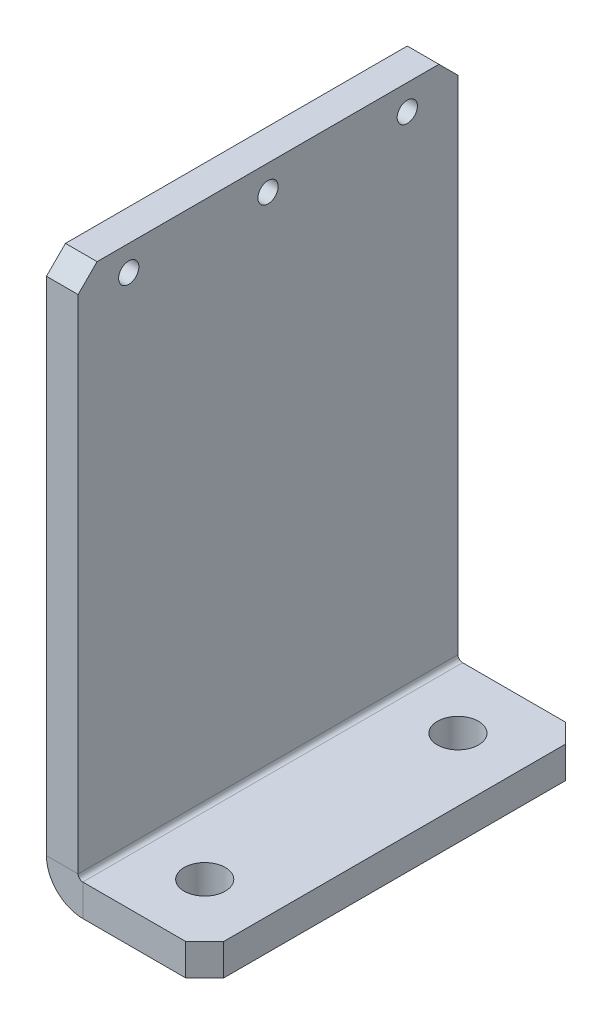
ISO-10303-21;
HEADER;
FILE_DESCRIPTION(('STEP AP214'),'2;1');
FILE_NAME('part.step','',(''),(''),'','','');
FILE_SCHEMA(('AUTOMOTIVE_DESIGN { 1 0 10303 214 1 1 1 1 }'));
ENDSEC;
DATA;
#1=APPLICATION_CONTEXT('core data for automotive mechanical design processes');
#2=APPLICATION_PROTOCOL_DEFINITION('international standard','automotive_design',2000,#1);
#3=PRODUCT_CONTEXT('',#1,'mechanical');
#4=PRODUCT('Part','Part','',(#3));
#5=PRODUCT_RELATED_PRODUCT_CATEGORY('part','',(#4));
#6=PRODUCT_DEFINITION_FORMATION('','',#4);
#7=PRODUCT_DEFINITION_CONTEXT('part definition',#1,'design');
#8=PRODUCT_DEFINITION('design','',#6,#7);
#9=PRODUCT_DEFINITION_SHAPE('','',#8);
#10=(LENGTH_UNIT() NAMED_UNIT(*) SI_UNIT(.MILLI.,.METRE.));
#11=(NAMED_UNIT(*) PLANE_ANGLE_UNIT() SI_UNIT($,.RADIAN.));
#12=(NAMED_UNIT(*) SI_UNIT($,.STERADIAN.) SOLID_ANGLE_UNIT());
#13=UNCERTAINTY_MEASURE_WITH_UNIT(LENGTH_MEASURE(1.E-05),#10,'distance_accuracy_value','');
#14=(GEOMETRIC_REPRESENTATION_CONTEXT(3) GLOBAL_UNCERTAINTY_ASSIGNED_CONTEXT((#13)) GLOBAL_UNIT_ASSIGNED_CONTEXT((#10,
#11,#12)) REPRESENTATION_CONTEXT('',''));
#15=CARTESIAN_POINT('',(0.,0.,0.));
#16=DIRECTION('',(0.,0.,1.));
#17=DIRECTION('',(1.,0.,0.));
#18=AXIS2_PLACEMENT_3D('',#15,#16,#17);
#19=CARTESIAN_POINT('',(0.7366,0.,30.));
#20=DIRECTION('',(0.,0.,1.));
#21=DIRECTION('',(1.,0.,0.));
#22=AXIS2_PLACEMENT_3D('',#19,#20,#21);
#23=PLANE('',#22);
#24=DIRECTION('',(0.,-1.,0.));
#25=VECTOR('',#24,1.);
#26=CARTESIAN_POINT('',(0.7366,0.,30.));
#27=LINE('',#26,#25);
#28=CARTESIAN_POINT('',(0.7366,0.,30.));
#29=VERTEX_POINT('',#28);
#30=CARTESIAN_POINT('',(0.7366,-5.,30.));
#31=VERTEX_POINT('',#30);
#32=EDGE_CURVE('E135',#29,#31,#27,.T.);
#33=ORIENTED_EDGE('',*,*,#32,.F.);
#34=CARTESIAN_POINT('',(0.7366,0.7366,30.));
#35=DIRECTION('',(0.,0.,-1.));
#36=DIRECTION('',(-1.,0.,0.));
#37=AXIS2_PLACEMENT_3D('',#34,#35,#36);
#38=CIRCLE('',#37,0.7366);
#39=CARTESIAN_POINT('',(0.,0.7366,30.));
#40=VERTEX_POINT('',#39);
#41=EDGE_CURVE('E139',#40,#29,#38,.F.);
#42=ORIENTED_EDGE('',*,*,#41,.F.);
#43=DIRECTION('',(1.,0.,0.));
#44=VECTOR('',#43,1.);
#45=CARTESIAN_POINT('',(-5.,0.736600000000001,30.));
#46=LINE('',#45,#44);
#47=CARTESIAN_POINT('',(-5.,0.736600000000001,30.));
#48=VERTEX_POINT('',#47);
#49=EDGE_CURVE('E145',#48,#40,#46,.T.);
#50=ORIENTED_EDGE('',*,*,#49,.F.);
#51=CARTESIAN_POINT('',(0.7366,0.7366,30.));
#52=DIRECTION('',(0.,0.,1.));
#53=DIRECTION('',(1.,0.,0.));
#54=AXIS2_PLACEMENT_3D('',#51,#52,#53);
#55=CIRCLE('',#54,5.7366);
#56=EDGE_CURVE('E141',#48,#31,#55,.T.);
#57=ORIENTED_EDGE('',*,*,#56,.T.);
#58=EDGE_LOOP('',(#33,#42,#50,#57));
#59=FACE_BOUND('',#58,.T.);
#60=ADVANCED_FACE('F44',(#59),#23,.T.);
#61=CARTESIAN_POINT('',(-5.,0.736600000000001,30.));
#62=DIRECTION('',(0.,0.,1.));
#63=DIRECTION('',(1.,0.,0.));
#64=AXIS2_PLACEMENT_3D('',#61,#62,#63);
#65=PLANE('',#64);
#66=DIRECTION('',(1.,0.,0.));
#67=VECTOR('',#66,1.);
#68=CARTESIAN_POINT('',(0.,-5.,30.));
#69=LINE('',#68,#67);
#70=CARTESIAN_POINT('',(17.,-5.,30.));
#71=VERTEX_POINT('',#70);
#72=EDGE_CURVE('E165',#31,#71,#69,.T.);
#73=ORIENTED_EDGE('',*,*,#72,.T.);
#74=DIRECTION('',(0.,1.,0.));
#75=VECTOR('',#74,1.);
#76=CARTESIAN_POINT('',(17.,0.736600000000001,30.));
#77=LINE('',#76,#75);
#78=CARTESIAN_POINT('',(17.,0.,30.));
#79=VERTEX_POINT('',#78);
#80=EDGE_CURVE('E54',#71,#79,#77,.T.);
#81=ORIENTED_EDGE('',*,*,#80,.T.);
#82=DIRECTION('',(1.,0.,0.));
#83=VECTOR('',#82,1.);
#84=CARTESIAN_POINT('',(0.,0.,30.));
#85=LINE('',#84,#83);
#86=EDGE_CURVE('E152',#29,#79,#85,.T.);
#87=ORIENTED_EDGE('',*,*,#86,.F.);
#88=ORIENTED_EDGE('',*,*,#32,.T.);
#89=EDGE_LOOP('',(#73,#81,#87,#88));
#90=FACE_BOUND('',#89,.T.);
#91=ADVANCED_FACE('F163',(#90),#65,.T.);
#92=CARTESIAN_POINT('',(0.,0.7366,-30.));
#93=DIRECTION('',(0.,0.,-1.));
#94=DIRECTION('',(-1.,0.,0.));
#95=AXIS2_PLACEMENT_3D('',#92,#93,#94);
#96=PLANE('',#95);
#97=DIRECTION('',(-1.,0.,0.));
#98=VECTOR('',#97,1.);
#99=CARTESIAN_POINT('',(0.,0.7366,-30.));
#100=LINE('',#99,#98);
#101=CARTESIAN_POINT('',(0.,0.7366,-30.));
#102=VERTEX_POINT('',#101);
#103=CARTESIAN_POINT('',(-5.,0.736600000000001,-30.));
#104=VERTEX_POINT('',#103);
#105=EDGE_CURVE('E228',#102,#104,#100,.T.);
#106=ORIENTED_EDGE('',*,*,#105,.F.);
#107=CARTESIAN_POINT('',(0.7366,0.7366,-30.));
#108=DIRECTION('',(0.,0.,-1.));
#109=DIRECTION('',(-1.,0.,0.));
#110=AXIS2_PLACEMENT_3D('',#107,#108,#109);
#111=CIRCLE('',#110,0.7366);
#112=CARTESIAN_POINT('',(0.7366,0.,-30.));
#113=VERTEX_POINT('',#112);
#114=EDGE_CURVE('E190',#102,#113,#111,.F.);
#115=ORIENTED_EDGE('',*,*,#114,.T.);
#116=DIRECTION('',(0.,1.,0.));
#117=VECTOR('',#116,1.);
#118=CARTESIAN_POINT('',(0.7366,-5.,-30.));
#119=LINE('',#118,#117);
#120=CARTESIAN_POINT('',(0.7366,-5.,-30.));
#121=VERTEX_POINT('',#120);
#122=EDGE_CURVE('E225',#121,#113,#119,.T.);
#123=ORIENTED_EDGE('',*,*,#122,.F.);
#124=CARTESIAN_POINT('',(0.7366,0.7366,-30.));
#125=DIRECTION('',(0.,0.,1.));
#126=DIRECTION('',(1.,0.,0.));
#127=AXIS2_PLACEMENT_3D('',#124,#125,#126);
#128=CIRCLE('',#127,5.7366);
#129=EDGE_CURVE('E199',#104,#121,#128,.T.);
#130=ORIENTED_EDGE('',*,*,#129,.F.);
#131=EDGE_LOOP('',(#106,#115,#123,#130));
#132=FACE_BOUND('',#131,.T.);
#133=ADVANCED_FACE('F304',(#132),#96,.T.);
#134=CARTESIAN_POINT('',(0.7366,-5.,-30.));
#135=DIRECTION('',(0.,0.,-1.));
#136=DIRECTION('',(-1.,0.,0.));
#137=AXIS2_PLACEMENT_3D('',#134,#135,#136);
#138=PLANE('',#137);
#139=DIRECTION('',(0.,1.,0.));
#140=VECTOR('',#139,1.);
#141=CARTESIAN_POINT('',(-5.,0.,-30.));
#142=LINE('',#141,#140);
#143=CARTESIAN_POINT('',(-5.,80.,-30.));
#144=VERTEX_POINT('',#143);
#145=EDGE_CURVE('E196',#144,#104,#142,.F.);
#146=ORIENTED_EDGE('',*,*,#145,.F.);
#147=DIRECTION('',(1.,0.,0.));
#148=VECTOR('',#147,1.);
#149=CARTESIAN_POINT('',(0.7366,80.,-30.));
#150=LINE('',#149,#148);
#151=CARTESIAN_POINT('',(0.,80.,-30.));
#152=VERTEX_POINT('',#151);
#153=EDGE_CURVE('E253',#144,#152,#150,.T.);
#154=ORIENTED_EDGE('',*,*,#153,.T.);
#155=DIRECTION('',(0.,-1.,0.));
#156=VECTOR('',#155,1.);
#157=CARTESIAN_POINT('',(0.,0.,-30.));
#158=LINE('',#157,#156);
#159=EDGE_CURVE('E193',#152,#102,#158,.T.);
#160=ORIENTED_EDGE('',*,*,#159,.T.);
#161=ORIENTED_EDGE('',*,*,#105,.T.);
#162=EDGE_LOOP('',(#146,#154,#160,#161));
#163=FACE_BOUND('',#162,.T.);
#164=ADVANCED_FACE('F360',(#163),#138,.T.);
#165=CARTESIAN_POINT('',(0.,-5.,30.));
#166=DIRECTION('',(0.,1.,0.));
#167=DIRECTION('',(0.,0.,1.));
#168=AXIS2_PLACEMENT_3D('',#165,#166,#167);
#169=PLANE('',#168);
#170=CARTESIAN_POINT('',(10.,-5.,20.));
#171=DIRECTION('',(0.,1.,0.));
#172=DIRECTION('',(0.,0.,1.));
#173=AXIS2_PLACEMENT_3D('',#170,#171,#172);
#174=CIRCLE('',#173,3.25);
#175=CARTESIAN_POINT('',(10.,-5.,23.25));
#176=VERTEX_POINT('',#175);
#177=EDGE_CURVE('E335',#176,#176,#174,.T.);
#178=ORIENTED_EDGE('',*,*,#177,.T.);
#179=EDGE_LOOP('',(#178));
#180=FACE_BOUND('',#179,.T.);
#181=CARTESIAN_POINT('',(10.,-5.,-20.));
#182=DIRECTION('',(0.,1.,0.));
#183=DIRECTION('',(0.,0.,1.));
#184=AXIS2_PLACEMENT_3D('',#181,#182,#183);
#185=CIRCLE('',#184,3.25);
#186=CARTESIAN_POINT('',(10.,-5.,-16.75));
#187=VERTEX_POINT('',#186);
#188=EDGE_CURVE('E327',#187,#187,#185,.T.);
#189=ORIENTED_EDGE('',*,*,#188,.T.);
#190=EDGE_LOOP('',(#189));
#191=FACE_BOUND('',#190,.T.);
#192=DIRECTION('',(0.,0.,-1.));
#193=VECTOR('',#192,1.);
#194=CARTESIAN_POINT('',(20.,-5.,30.));
#195=LINE('',#194,#193);
#196=CARTESIAN_POINT('',(20.,-5.,27.));
#197=VERTEX_POINT('',#196);
#198=CARTESIAN_POINT('',(20.,-5.,-27.));
#199=VERTEX_POINT('',#198);
#200=EDGE_CURVE('E222',#197,#199,#195,.T.);
#201=ORIENTED_EDGE('',*,*,#200,.F.);
#202=DIRECTION('',(0.707106781186548,0.,-0.707106781186548));
#203=VECTOR('',#202,1.);
#204=CARTESIAN_POINT('',(20.,-5.,27.));
#205=LINE('',#204,#203);
#206=EDGE_CURVE('E68',#197,#71,#205,.F.);
#207=ORIENTED_EDGE('',*,*,#206,.T.);
#208=ORIENTED_EDGE('',*,*,#72,.F.);
#209=DIRECTION('',(0.,0.,-1.));
#210=VECTOR('',#209,1.);
#211=CARTESIAN_POINT('',(0.7366,-5.,30.));
#212=LINE('',#211,#210);
#213=EDGE_CURVE('E182',#31,#121,#212,.T.);
#214=ORIENTED_EDGE('',*,*,#213,.T.);
#215=DIRECTION('',(1.,0.,0.));
#216=VECTOR('',#215,1.);
#217=CARTESIAN_POINT('',(0.,-5.,-30.));
#218=LINE('',#217,#216);
#219=CARTESIAN_POINT('',(17.,-5.,-30.));
#220=VERTEX_POINT('',#219);
#221=EDGE_CURVE('E183',#121,#220,#218,.T.);
#222=ORIENTED_EDGE('',*,*,#221,.T.);
#223=DIRECTION('',(-0.707106781186548,0.,-0.707106781186547));
#224=VECTOR('',#223,1.);
#225=CARTESIAN_POINT('',(17.,-5.,-30.));
#226=LINE('',#225,#224);
#227=EDGE_CURVE('E270',#220,#199,#226,.F.);
#228=ORIENTED_EDGE('',*,*,#227,.T.);
#229=EDGE_LOOP('',(#201,#207,#208,#214,#222,#228));
#230=FACE_BOUND('',#229,.T.);
#231=ADVANCED_FACE('F292',(#180,#191,#230),#169,.F.);
#232=CARTESIAN_POINT('',(20.,0.,30.));
#233=DIRECTION('',(1.,0.,0.));
#234=DIRECTION('',(0.,0.,-1.));
#235=AXIS2_PLACEMENT_3D('',#232,#233,#234);
#236=PLANE('',#235);
#237=DIRECTION('',(0.,0.,-1.));
#238=VECTOR('',#237,1.);
#239=CARTESIAN_POINT('',(20.,0.,30.));
#240=LINE('',#239,#238);
#241=CARTESIAN_POINT('',(20.,0.,27.));
#242=VERTEX_POINT('',#241);
#243=CARTESIAN_POINT('',(20.,0.,-27.));
#244=VERTEX_POINT('',#243);
#245=EDGE_CURVE('E160',#242,#244,#240,.T.);
#246=ORIENTED_EDGE('',*,*,#245,.F.);
#247=DIRECTION('',(0.,-1.,0.));
#248=VECTOR('',#247,1.);
#249=CARTESIAN_POINT('',(20.,0.,27.));
#250=LINE('',#249,#248);
#251=EDGE_CURVE('E281',#242,#197,#250,.T.);
#252=ORIENTED_EDGE('',*,*,#251,.T.);
#253=ORIENTED_EDGE('',*,*,#200,.T.);
#254=DIRECTION('',(0.,1.,0.));
#255=VECTOR('',#254,1.);
#256=CARTESIAN_POINT('',(20.,0.,-27.));
#257=LINE('',#256,#255);
#258=EDGE_CURVE('E274',#199,#244,#257,.T.);
#259=ORIENTED_EDGE('',*,*,#258,.T.);
#260=EDGE_LOOP('',(#246,#252,#253,#259));
#261=FACE_BOUND('',#260,.T.);
#262=ADVANCED_FACE('F290',(#261),#236,.T.);
#263=CARTESIAN_POINT('',(0.,0.,30.));
#264=DIRECTION('',(0.,1.,0.));
#265=DIRECTION('',(0.,0.,1.));
#266=AXIS2_PLACEMENT_3D('',#263,#264,#265);
#267=PLANE('',#266);
#268=CARTESIAN_POINT('',(10.,0.,20.));
#269=DIRECTION('',(0.,1.,0.));
#270=DIRECTION('',(0.,0.,1.));
#271=AXIS2_PLACEMENT_3D('',#268,#269,#270);
#272=CIRCLE('',#271,3.25);
#273=CARTESIAN_POINT('',(10.,0.,23.25));
#274=VERTEX_POINT('',#273);
#275=EDGE_CURVE('E339',#274,#274,#272,.T.);
#276=ORIENTED_EDGE('',*,*,#275,.F.);
#277=EDGE_LOOP('',(#276));
#278=FACE_BOUND('',#277,.T.);
#279=CARTESIAN_POINT('',(10.,0.,-20.));
#280=DIRECTION('',(0.,1.,0.));
#281=DIRECTION('',(0.,0.,1.));
#282=AXIS2_PLACEMENT_3D('',#279,#280,#281);
#283=CIRCLE('',#282,3.25);
#284=CARTESIAN_POINT('',(10.,0.,-16.75));
#285=VERTEX_POINT('',#284);
#286=EDGE_CURVE('E331',#285,#285,#283,.T.);
#287=ORIENTED_EDGE('',*,*,#286,.F.);
#288=EDGE_LOOP('',(#287));
#289=FACE_BOUND('',#288,.T.);
#290=ORIENTED_EDGE('',*,*,#86,.T.);
#291=DIRECTION('',(-0.707106781186548,0.,0.707106781186548));
#292=VECTOR('',#291,1.);
#293=CARTESIAN_POINT('',(8.49999999999999,0.,38.5));
#294=LINE('',#293,#292);
#295=EDGE_CURVE('E11',#79,#242,#294,.F.);
#296=ORIENTED_EDGE('',*,*,#295,.T.);
#297=ORIENTED_EDGE('',*,*,#245,.T.);
#298=DIRECTION('',(0.707106781186548,0.,0.707106781186547));
#299=VECTOR('',#298,1.);
#300=CARTESIAN_POINT('',(38.5,0.,-8.50000000000002));
#301=LINE('',#300,#299);
#302=CARTESIAN_POINT('',(17.,0.,-30.));
#303=VERTEX_POINT('',#302);
#304=EDGE_CURVE('E278',#244,#303,#301,.F.);
#305=ORIENTED_EDGE('',*,*,#304,.T.);
#306=DIRECTION('',(1.,0.,0.));
#307=VECTOR('',#306,1.);
#308=CARTESIAN_POINT('',(0.,0.,-30.));
#309=LINE('',#308,#307);
#310=EDGE_CURVE('E155',#113,#303,#309,.T.);
#311=ORIENTED_EDGE('',*,*,#310,.F.);
#312=DIRECTION('',(0.,0.,-1.));
#313=VECTOR('',#312,1.);
#314=CARTESIAN_POINT('',(0.7366,0.,30.));
#315=LINE('',#314,#313);
#316=EDGE_CURVE('E150',#29,#113,#315,.T.);
#317=ORIENTED_EDGE('',*,*,#316,.F.);
#318=EDGE_LOOP('',(#290,#296,#297,#305,#311,#317));
#319=FACE_BOUND('',#318,.T.);
#320=ADVANCED_FACE('F151',(#278,#289,#319),#267,.T.);
#321=CARTESIAN_POINT('',(0.7366,0.7366,30.));
#322=DIRECTION('',(0.,0.,-1.));
#323=DIRECTION('',(-1.,0.,0.));
#324=AXIS2_PLACEMENT_3D('',#321,#322,#323);
#325=CYLINDRICAL_SURFACE('',#324,0.7366);
#326=ORIENTED_EDGE('',*,*,#114,.F.);
#327=DIRECTION('',(0.,0.,-1.));
#328=VECTOR('',#327,1.);
#329=CARTESIAN_POINT('',(0.,0.7366,30.));
#330=LINE('',#329,#328);
#331=EDGE_CURVE('E161',#40,#102,#330,.T.);
#332=ORIENTED_EDGE('',*,*,#331,.F.);
#333=ORIENTED_EDGE('',*,*,#41,.T.);
#334=ORIENTED_EDGE('',*,*,#316,.T.);
#335=EDGE_LOOP('',(#326,#332,#333,#334));
#336=FACE_BOUND('',#335,.T.);
#337=ADVANCED_FACE('F168',(#336),#325,.F.);
#338=CARTESIAN_POINT('',(0.,0.,30.));
#339=DIRECTION('',(1.,0.,0.));
#340=DIRECTION('',(0.,0.,-1.));
#341=AXIS2_PLACEMENT_3D('',#338,#339,#340);
#342=PLANE('',#341);
#343=CARTESIAN_POINT('',(0.,79.,22.));
#344=DIRECTION('',(1.,0.,0.));
#345=DIRECTION('',(0.,0.,-1.));
#346=AXIS2_PLACEMENT_3D('',#343,#344,#345);
#347=CIRCLE('',#346,1.6);
#348=CARTESIAN_POINT('',(0.,79.,20.4));
#349=VERTEX_POINT('',#348);
#350=EDGE_CURVE('E323',#349,#349,#347,.T.);
#351=ORIENTED_EDGE('',*,*,#350,.F.);
#352=EDGE_LOOP('',(#351));
#353=FACE_BOUND('',#352,.T.);
#354=CARTESIAN_POINT('',(0.,79.,0.));
#355=DIRECTION('',(1.,0.,0.));
#356=DIRECTION('',(0.,0.,-1.));
#357=AXIS2_PLACEMENT_3D('',#354,#355,#356);
#358=CIRCLE('',#357,1.6);
#359=CARTESIAN_POINT('',(0.,79.,-1.6));
#360=VERTEX_POINT('',#359);
#361=EDGE_CURVE('E240',#360,#360,#358,.T.);
#362=ORIENTED_EDGE('',*,*,#361,.F.);
#363=EDGE_LOOP('',(#362));
#364=FACE_BOUND('',#363,.T.);
#365=CARTESIAN_POINT('',(0.,79.,-22.));
#366=DIRECTION('',(1.,0.,0.));
#367=DIRECTION('',(0.,0.,-1.));
#368=AXIS2_PLACEMENT_3D('',#365,#366,#367);
#369=CIRCLE('',#368,1.6);
#370=CARTESIAN_POINT('',(0.,79.,-23.6));
#371=VERTEX_POINT('',#370);
#372=EDGE_CURVE('E239',#371,#371,#369,.T.);
#373=ORIENTED_EDGE('',*,*,#372,.F.);
#374=EDGE_LOOP('',(#373));
#375=FACE_BOUND('',#374,.T.);
#376=ORIENTED_EDGE('',*,*,#159,.F.);
#377=DIRECTION('',(0.,-0.707106781186548,-0.707106781186548));
#378=VECTOR('',#377,1.);
#379=CARTESIAN_POINT('',(0.,70.,-40.));
#380=LINE('',#379,#378);
#381=CARTESIAN_POINT('',(0.,83.,-27.));
#382=VERTEX_POINT('',#381);
#383=EDGE_CURVE('E257',#152,#382,#380,.F.);
#384=ORIENTED_EDGE('',*,*,#383,.T.);
#385=DIRECTION('',(0.,0.,-1.));
#386=VECTOR('',#385,1.);
#387=CARTESIAN_POINT('',(0.,83.,30.));
#388=LINE('',#387,#386);
#389=CARTESIAN_POINT('',(0.,83.,27.));
#390=VERTEX_POINT('',#389);
#391=EDGE_CURVE('E214',#390,#382,#388,.T.);
#392=ORIENTED_EDGE('',*,*,#391,.F.);
#393=DIRECTION('',(0.,-0.707106781186547,0.707106781186548));
#394=VECTOR('',#393,1.);
#395=CARTESIAN_POINT('',(0.,40.,70.));
#396=LINE('',#395,#394);
#397=CARTESIAN_POINT('',(0.,80.,30.));
#398=VERTEX_POINT('',#397);
#399=EDGE_CURVE('E244',#390,#398,#396,.T.);
#400=ORIENTED_EDGE('',*,*,#399,.T.);
#401=DIRECTION('',(0.,-1.,0.));
#402=VECTOR('',#401,1.);
#403=CARTESIAN_POINT('',(0.,0.,30.));
#404=LINE('',#403,#402);
#405=EDGE_CURVE('E171',#398,#40,#404,.T.);
#406=ORIENTED_EDGE('',*,*,#405,.T.);
#407=ORIENTED_EDGE('',*,*,#331,.T.);
#408=EDGE_LOOP('',(#376,#384,#392,#400,#406,#407));
#409=FACE_BOUND('',#408,.T.);
#410=ADVANCED_FACE('F468',(#353,#364,#375,#409),#342,.T.);
#411=CARTESIAN_POINT('',(-5.,83.,30.));
#412=DIRECTION('',(0.,1.,0.));
#413=DIRECTION('',(0.,0.,1.));
#414=AXIS2_PLACEMENT_3D('',#411,#412,#413);
#415=PLANE('',#414);
#416=ORIENTED_EDGE('',*,*,#391,.T.);
#417=DIRECTION('',(-1.,0.,0.));
#418=VECTOR('',#417,1.);
#419=CARTESIAN_POINT('',(-5.,83.,-27.));
#420=LINE('',#419,#418);
#421=CARTESIAN_POINT('',(-5.,83.,-27.));
#422=VERTEX_POINT('',#421);
#423=EDGE_CURVE('E260',#382,#422,#420,.T.);
#424=ORIENTED_EDGE('',*,*,#423,.T.);
#425=DIRECTION('',(0.,0.,-1.));
#426=VECTOR('',#425,1.);
#427=CARTESIAN_POINT('',(-5.,83.,30.));
#428=LINE('',#427,#426);
#429=CARTESIAN_POINT('',(-5.,83.,27.));
#430=VERTEX_POINT('',#429);
#431=EDGE_CURVE('E210',#430,#422,#428,.T.);
#432=ORIENTED_EDGE('',*,*,#431,.F.);
#433=DIRECTION('',(1.,0.,0.));
#434=VECTOR('',#433,1.);
#435=CARTESIAN_POINT('',(0.,83.,27.));
#436=LINE('',#435,#434);
#437=EDGE_CURVE('E144',#430,#390,#436,.T.);
#438=ORIENTED_EDGE('',*,*,#437,.T.);
#439=EDGE_LOOP('',(#416,#424,#432,#438));
#440=FACE_BOUND('',#439,.T.);
#441=ADVANCED_FACE('F457',(#440),#415,.T.);
#442=CARTESIAN_POINT('',(-5.,0.,30.));
#443=DIRECTION('',(1.,0.,0.));
#444=DIRECTION('',(0.,0.,-1.));
#445=AXIS2_PLACEMENT_3D('',#442,#443,#444);
#446=PLANE('',#445);
#447=CARTESIAN_POINT('',(-5.,79.,22.));
#448=DIRECTION('',(1.,0.,0.));
#449=DIRECTION('',(0.,0.,-1.));
#450=AXIS2_PLACEMENT_3D('',#447,#448,#449);
#451=CIRCLE('',#450,1.6);
#452=CARTESIAN_POINT('',(-5.,79.,20.4));
#453=VERTEX_POINT('',#452);
#454=EDGE_CURVE('E319',#453,#453,#451,.T.);
#455=ORIENTED_EDGE('',*,*,#454,.T.);
#456=EDGE_LOOP('',(#455));
#457=FACE_BOUND('',#456,.T.);
#458=CARTESIAN_POINT('',(-5.,79.,0.));
#459=DIRECTION('',(1.,0.,0.));
#460=DIRECTION('',(0.,0.,-1.));
#461=AXIS2_PLACEMENT_3D('',#458,#459,#460);
#462=CIRCLE('',#461,1.6);
#463=CARTESIAN_POINT('',(-5.,79.,-1.6));
#464=VERTEX_POINT('',#463);
#465=EDGE_CURVE('E235',#464,#464,#462,.T.);
#466=ORIENTED_EDGE('',*,*,#465,.T.);
#467=EDGE_LOOP('',(#466));
#468=FACE_BOUND('',#467,.T.);
#469=CARTESIAN_POINT('',(-5.,79.,-22.));
#470=DIRECTION('',(1.,0.,0.));
#471=DIRECTION('',(0.,0.,-1.));
#472=AXIS2_PLACEMENT_3D('',#469,#470,#471);
#473=CIRCLE('',#472,1.6);
#474=CARTESIAN_POINT('',(-5.,79.,-23.6));
#475=VERTEX_POINT('',#474);
#476=EDGE_CURVE('E187',#475,#475,#473,.T.);
#477=ORIENTED_EDGE('',*,*,#476,.T.);
#478=EDGE_LOOP('',(#477));
#479=FACE_BOUND('',#478,.T.);
#480=ORIENTED_EDGE('',*,*,#431,.T.);
#481=DIRECTION('',(0.,0.707106781186548,0.707106781186548));
#482=VECTOR('',#481,1.);
#483=CARTESIAN_POINT('',(-5.,80.,-30.));
#484=LINE('',#483,#482);
#485=EDGE_CURVE('E263',#422,#144,#484,.F.);
#486=ORIENTED_EDGE('',*,*,#485,.T.);
#487=ORIENTED_EDGE('',*,*,#145,.T.);
#488=DIRECTION('',(0.,0.,-1.));
#489=VECTOR('',#488,1.);
#490=CARTESIAN_POINT('',(-5.,0.736600000000001,30.));
#491=LINE('',#490,#489);
#492=EDGE_CURVE('E206',#48,#104,#491,.T.);
#493=ORIENTED_EDGE('',*,*,#492,.F.);
#494=DIRECTION('',(0.,1.,0.));
#495=VECTOR('',#494,1.);
#496=CARTESIAN_POINT('',(-5.,0.,30.));
#497=LINE('',#496,#495);
#498=CARTESIAN_POINT('',(-5.,80.,30.));
#499=VERTEX_POINT('',#498);
#500=EDGE_CURVE('E174',#499,#48,#497,.F.);
#501=ORIENTED_EDGE('',*,*,#500,.F.);
#502=DIRECTION('',(0.,0.707106781186547,-0.707106781186548));
#503=VECTOR('',#502,1.);
#504=CARTESIAN_POINT('',(-5.,83.,27.));
#505=LINE('',#504,#503);
#506=EDGE_CURVE('E250',#499,#430,#505,.T.);
#507=ORIENTED_EDGE('',*,*,#506,.T.);
#508=EDGE_LOOP('',(#480,#486,#487,#493,#501,#507));
#509=FACE_BOUND('',#508,.T.);
#510=ADVANCED_FACE('F452',(#457,#468,#479,#509),#446,.F.);
#511=CARTESIAN_POINT('',(0.7366,0.7366,30.));
#512=DIRECTION('',(0.,0.,-1.));
#513=DIRECTION('',(-1.,0.,0.));
#514=AXIS2_PLACEMENT_3D('',#511,#512,#513);
#515=CYLINDRICAL_SURFACE('',#514,5.7366);
#516=ORIENTED_EDGE('',*,*,#129,.T.);
#517=ORIENTED_EDGE('',*,*,#213,.F.);
#518=ORIENTED_EDGE('',*,*,#56,.F.);
#519=ORIENTED_EDGE('',*,*,#492,.T.);
#520=EDGE_LOOP('',(#516,#517,#518,#519));
#521=FACE_BOUND('',#520,.T.);
#522=ADVANCED_FACE('F306',(#521),#515,.T.);
#523=CARTESIAN_POINT('',(0.7366,0.7366,30.));
#524=DIRECTION('',(0.,0.,-1.));
#525=DIRECTION('',(-1.,0.,0.));
#526=AXIS2_PLACEMENT_3D('',#523,#524,#525);
#527=PLANE('',#526);
#528=ORIENTED_EDGE('',*,*,#405,.F.);
#529=DIRECTION('',(-1.,0.,0.));
#530=VECTOR('',#529,1.);
#531=CARTESIAN_POINT('',(-5.,80.,30.));
#532=LINE('',#531,#530);
#533=EDGE_CURVE('E247',#398,#499,#532,.T.);
#534=ORIENTED_EDGE('',*,*,#533,.T.);
#535=ORIENTED_EDGE('',*,*,#500,.T.);
#536=ORIENTED_EDGE('',*,*,#49,.T.);
#537=EDGE_LOOP('',(#528,#534,#535,#536));
#538=FACE_BOUND('',#537,.T.);
#539=ADVANCED_FACE('F432',(#538),#527,.F.);
#540=CARTESIAN_POINT('',(0.7366,0.7366,-30.));
#541=DIRECTION('',(0.,0.,-1.));
#542=DIRECTION('',(-1.,0.,0.));
#543=AXIS2_PLACEMENT_3D('',#540,#541,#542);
#544=PLANE('',#543);
#545=ORIENTED_EDGE('',*,*,#310,.T.);
#546=DIRECTION('',(0.,-1.,0.));
#547=VECTOR('',#546,1.);
#548=CARTESIAN_POINT('',(17.,0.7366,-30.));
#549=LINE('',#548,#547);
#550=EDGE_CURVE('E266',#303,#220,#549,.T.);
#551=ORIENTED_EDGE('',*,*,#550,.T.);
#552=ORIENTED_EDGE('',*,*,#221,.F.);
#553=ORIENTED_EDGE('',*,*,#122,.T.);
#554=EDGE_LOOP('',(#545,#551,#552,#553));
#555=FACE_BOUND('',#554,.T.);
#556=ADVANCED_FACE('F300',(#555),#544,.T.);
#557=CARTESIAN_POINT('',(0.,79.,-22.));
#558=DIRECTION('',(1.,0.,0.));
#559=DIRECTION('',(0.,0.,-1.));
#560=AXIS2_PLACEMENT_3D('',#557,#558,#559);
#561=CYLINDRICAL_SURFACE('',#560,1.6);
#562=ORIENTED_EDGE('',*,*,#372,.T.);
#563=EDGE_LOOP('',(#562));
#564=FACE_BOUND('',#563,.T.);
#565=ORIENTED_EDGE('',*,*,#476,.F.);
#566=EDGE_LOOP('',(#565));
#567=FACE_BOUND('',#566,.T.);
#568=ADVANCED_FACE('F431',(#564,#567),#561,.F.);
#569=CARTESIAN_POINT('',(0.,79.,0.));
#570=DIRECTION('',(1.,0.,0.));
#571=DIRECTION('',(0.,0.,-1.));
#572=AXIS2_PLACEMENT_3D('',#569,#570,#571);
#573=CYLINDRICAL_SURFACE('',#572,1.6);
#574=ORIENTED_EDGE('',*,*,#361,.T.);
#575=EDGE_LOOP('',(#574));
#576=FACE_BOUND('',#575,.T.);
#577=ORIENTED_EDGE('',*,*,#465,.F.);
#578=EDGE_LOOP('',(#577));
#579=FACE_BOUND('',#578,.T.);
#580=ADVANCED_FACE('F540',(#576,#579),#573,.F.);
#581=CARTESIAN_POINT('',(0.,79.,22.));
#582=DIRECTION('',(1.,0.,0.));
#583=DIRECTION('',(0.,0.,-1.));
#584=AXIS2_PLACEMENT_3D('',#581,#582,#583);
#585=CYLINDRICAL_SURFACE('',#584,1.6);
#586=ORIENTED_EDGE('',*,*,#350,.T.);
#587=EDGE_LOOP('',(#586));
#588=FACE_BOUND('',#587,.T.);
#589=ORIENTED_EDGE('',*,*,#454,.F.);
#590=EDGE_LOOP('',(#589));
#591=FACE_BOUND('',#590,.T.);
#592=ADVANCED_FACE('F355',(#588,#591),#585,.F.);
#593=CARTESIAN_POINT('',(10.,0.,-20.));
#594=DIRECTION('',(0.,1.,0.));
#595=DIRECTION('',(0.,0.,1.));
#596=AXIS2_PLACEMENT_3D('',#593,#594,#595);
#597=CYLINDRICAL_SURFACE('',#596,3.25);
#598=ORIENTED_EDGE('',*,*,#286,.T.);
#599=EDGE_LOOP('',(#598));
#600=FACE_BOUND('',#599,.T.);
#601=ORIENTED_EDGE('',*,*,#188,.F.);
#602=EDGE_LOOP('',(#601));
#603=FACE_BOUND('',#602,.T.);
#604=ADVANCED_FACE('F352',(#600,#603),#597,.F.);
#605=CARTESIAN_POINT('',(10.,0.,20.));
#606=DIRECTION('',(0.,1.,0.));
#607=DIRECTION('',(0.,0.,1.));
#608=AXIS2_PLACEMENT_3D('',#605,#606,#607);
#609=CYLINDRICAL_SURFACE('',#608,3.25);
#610=ORIENTED_EDGE('',*,*,#275,.T.);
#611=EDGE_LOOP('',(#610));
#612=FACE_BOUND('',#611,.T.);
#613=ORIENTED_EDGE('',*,*,#177,.F.);
#614=EDGE_LOOP('',(#613));
#615=FACE_BOUND('',#614,.T.);
#616=ADVANCED_FACE('F344',(#612,#615),#609,.F.);
#617=CARTESIAN_POINT('',(-5.,83.,27.));
#618=DIRECTION('',(0.,0.707106781186548,0.707106781186547));
#619=DIRECTION('',(-1.,0.,0.));
#620=AXIS2_PLACEMENT_3D('',#617,#618,#619);
#621=PLANE('',#620);
#622=ORIENTED_EDGE('',*,*,#506,.F.);
#623=ORIENTED_EDGE('',*,*,#533,.F.);
#624=ORIENTED_EDGE('',*,*,#399,.F.);
#625=ORIENTED_EDGE('',*,*,#437,.F.);
#626=EDGE_LOOP('',(#622,#623,#624,#625));
#627=FACE_BOUND('',#626,.T.);
#628=ADVANCED_FACE('F379',(#627),#621,.T.);
#629=CARTESIAN_POINT('',(0.7366,80.,-30.));
#630=DIRECTION('',(0.,-0.707106781186548,0.707106781186548));
#631=DIRECTION('',(1.,0.,0.));
#632=AXIS2_PLACEMENT_3D('',#629,#630,#631);
#633=PLANE('',#632);
#634=ORIENTED_EDGE('',*,*,#485,.F.);
#635=ORIENTED_EDGE('',*,*,#423,.F.);
#636=ORIENTED_EDGE('',*,*,#383,.F.);
#637=ORIENTED_EDGE('',*,*,#153,.F.);
#638=EDGE_LOOP('',(#634,#635,#636,#637));
#639=FACE_BOUND('',#638,.T.);
#640=ADVANCED_FACE('F385',(#639),#633,.F.);
#641=CARTESIAN_POINT('',(17.,0.7366,-30.));
#642=DIRECTION('',(-0.707106781186547,0.,0.707106781186548));
#643=DIRECTION('',(0.,-1.,0.));
#644=AXIS2_PLACEMENT_3D('',#641,#642,#643);
#645=PLANE('',#644);
#646=ORIENTED_EDGE('',*,*,#304,.F.);
#647=ORIENTED_EDGE('',*,*,#258,.F.);
#648=ORIENTED_EDGE('',*,*,#227,.F.);
#649=ORIENTED_EDGE('',*,*,#550,.F.);
#650=EDGE_LOOP('',(#646,#647,#648,#649));
#651=FACE_BOUND('',#650,.T.);
#652=ADVANCED_FACE('F298',(#651),#645,.F.);
#653=CARTESIAN_POINT('',(20.,0.,27.));
#654=DIRECTION('',(-0.707106781186547,0.,-0.707106781186547));
#655=DIRECTION('',(0.,-1.,0.));
#656=AXIS2_PLACEMENT_3D('',#653,#654,#655);
#657=PLANE('',#656);
#658=ORIENTED_EDGE('',*,*,#295,.F.);
#659=ORIENTED_EDGE('',*,*,#80,.F.);
#660=ORIENTED_EDGE('',*,*,#206,.F.);
#661=ORIENTED_EDGE('',*,*,#251,.F.);
#662=EDGE_LOOP('',(#658,#659,#660,#661));
#663=FACE_BOUND('',#662,.T.);
#664=ADVANCED_FACE('F47',(#663),#657,.F.);
#665=CLOSED_SHELL('',(#60,#91,#133,#164,#231,#262,#320,#337,#410,#441,#510,#522,#539,#556,#568,
#580,#592,#604,#616,#628,#640,#652,#664));
#666=MANIFOLD_SOLID_BREP('B2',#665);
#667=ADVANCED_BREP_SHAPE_REPRESENTATION('',(#18,#666),#14);
#668=SHAPE_DEFINITION_REPRESENTATION(#9,#667);
ENDSEC;
END-ISO-10303-21;
